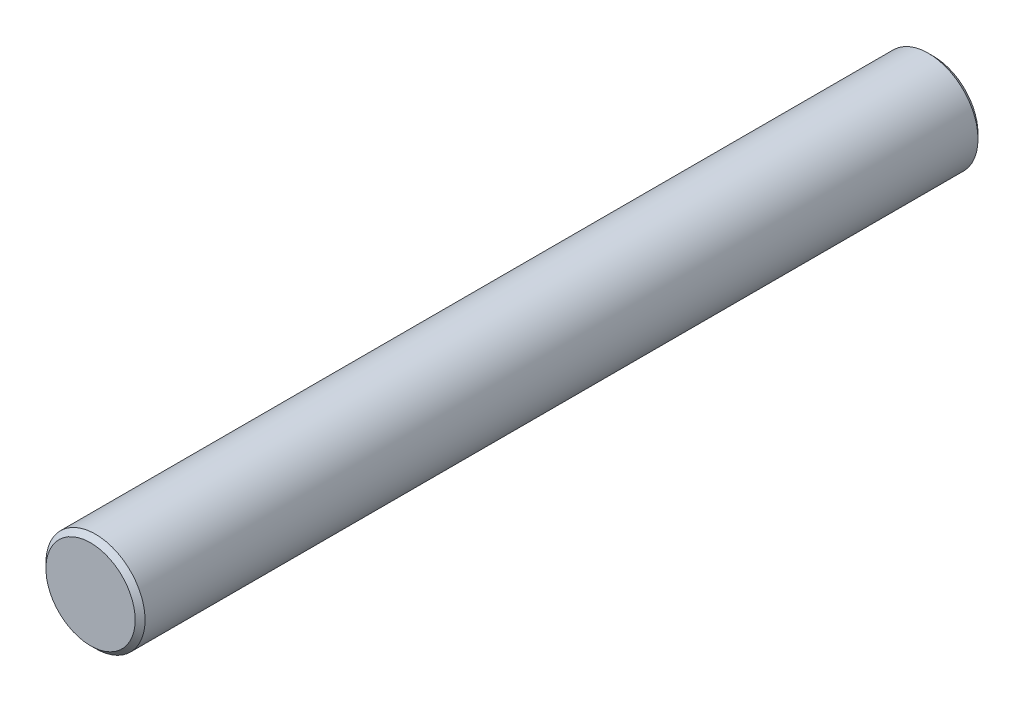
ISO-10303-21;
HEADER;
FILE_DESCRIPTION(('STEP AP214'),'2;1');
FILE_NAME('part.step','',(''),(''),'','','');
FILE_SCHEMA(('AUTOMOTIVE_DESIGN { 1 0 10303 214 1 1 1 1 }'));
ENDSEC;
DATA;
#1=APPLICATION_CONTEXT('core data for automotive mechanical design processes');
#2=APPLICATION_PROTOCOL_DEFINITION('international standard','automotive_design',2000,#1);
#3=PRODUCT_CONTEXT('',#1,'mechanical');
#4=PRODUCT('Part','Part','',(#3));
#5=PRODUCT_RELATED_PRODUCT_CATEGORY('part','',(#4));
#6=PRODUCT_DEFINITION_FORMATION('','',#4);
#7=PRODUCT_DEFINITION_CONTEXT('part definition',#1,'design');
#8=PRODUCT_DEFINITION('design','',#6,#7);
#9=PRODUCT_DEFINITION_SHAPE('','',#8);
#10=(LENGTH_UNIT() NAMED_UNIT(*) SI_UNIT(.MILLI.,.METRE.));
#11=(NAMED_UNIT(*) PLANE_ANGLE_UNIT() SI_UNIT($,.RADIAN.));
#12=(NAMED_UNIT(*) SI_UNIT($,.STERADIAN.) SOLID_ANGLE_UNIT());
#13=UNCERTAINTY_MEASURE_WITH_UNIT(LENGTH_MEASURE(1.E-05),#10,'distance_accuracy_value','');
#14=(GEOMETRIC_REPRESENTATION_CONTEXT(3) GLOBAL_UNCERTAINTY_ASSIGNED_CONTEXT((#13)) GLOBAL_UNIT_ASSIGNED_CONTEXT((#10,
#11,#12)) REPRESENTATION_CONTEXT('',''));
#15=CARTESIAN_POINT('',(0.,0.,0.));
#16=DIRECTION('',(0.,0.,1.));
#17=DIRECTION('',(1.,0.,0.));
#18=AXIS2_PLACEMENT_3D('',#15,#16,#17);
#19=CARTESIAN_POINT('',(0.,0.,170.));
#20=DIRECTION('',(0.,0.,-1.));
#21=DIRECTION('',(-1.,0.,0.));
#22=AXIS2_PLACEMENT_3D('',#19,#20,#21);
#23=CYLINDRICAL_SURFACE('',#22,10.);
#24=CARTESIAN_POINT('',(0.,0.,0.999999999999973));
#25=DIRECTION('',(0.,0.,1.));
#26=DIRECTION('',(1.,0.,0.));
#27=AXIS2_PLACEMENT_3D('',#24,#25,#26);
#28=CIRCLE('',#27,10.);
#29=CARTESIAN_POINT('',(10.,0.,0.999999999999973));
#30=VERTEX_POINT('',#29);
#31=EDGE_CURVE('E43',#30,#30,#28,.T.);
#32=ORIENTED_EDGE('',*,*,#31,.T.);
#33=EDGE_LOOP('',(#32));
#34=FACE_BOUND('',#33,.T.);
#35=CARTESIAN_POINT('',(0.,0.,169.));
#36=DIRECTION('',(0.,0.,1.));
#37=DIRECTION('',(1.,0.,0.));
#38=AXIS2_PLACEMENT_3D('',#35,#36,#37);
#39=CIRCLE('',#38,10.);
#40=CARTESIAN_POINT('',(10.,0.,169.));
#41=VERTEX_POINT('',#40);
#42=EDGE_CURVE('E47',#41,#41,#39,.F.);
#43=ORIENTED_EDGE('',*,*,#42,.T.);
#44=EDGE_LOOP('',(#43));
#45=FACE_BOUND('',#44,.T.);
#46=ADVANCED_FACE('F32',(#34,#45),#23,.T.);
#47=CARTESIAN_POINT('',(0.,0.,170.));
#48=DIRECTION('',(0.,0.,1.));
#49=DIRECTION('',(1.,0.,0.));
#50=AXIS2_PLACEMENT_3D('',#47,#48,#49);
#51=PLANE('',#50);
#52=CARTESIAN_POINT('',(0.,0.,170.));
#53=DIRECTION('',(0.,0.,1.));
#54=DIRECTION('',(1.,0.,0.));
#55=AXIS2_PLACEMENT_3D('',#52,#53,#54);
#56=CIRCLE('',#55,9.00000000000001);
#57=CARTESIAN_POINT('',(9.00000000000001,0.,170.));
#58=VERTEX_POINT('',#57);
#59=EDGE_CURVE('E10',#58,#58,#56,.T.);
#60=ORIENTED_EDGE('',*,*,#59,.T.);
#61=EDGE_LOOP('',(#60));
#62=FACE_BOUND('',#61,.T.);
#63=ADVANCED_FACE('F63',(#62),#51,.T.);
#64=CARTESIAN_POINT('',(0.,0.,0.));
#65=DIRECTION('',(0.,0.,1.));
#66=DIRECTION('',(1.,0.,0.));
#67=AXIS2_PLACEMENT_3D('',#64,#65,#66);
#68=PLANE('',#67);
#69=CARTESIAN_POINT('',(0.,0.,0.));
#70=DIRECTION('',(0.,0.,1.));
#71=DIRECTION('',(1.,0.,0.));
#72=AXIS2_PLACEMENT_3D('',#69,#70,#71);
#73=CIRCLE('',#72,9.00000000000002);
#74=CARTESIAN_POINT('',(9.00000000000002,0.,0.));
#75=VERTEX_POINT('',#74);
#76=EDGE_CURVE('E39',#75,#75,#73,.F.);
#77=ORIENTED_EDGE('',*,*,#76,.T.);
#78=EDGE_LOOP('',(#77));
#79=FACE_BOUND('',#78,.T.);
#80=ADVANCED_FACE('F60',(#79),#68,.F.);
#81=CARTESIAN_POINT('',(0.,0.,0.999999999999973));
#82=DIRECTION('',(0.,0.,1.));
#83=DIRECTION('',(1.,0.,0.));
#84=AXIS2_PLACEMENT_3D('',#81,#82,#83);
#85=CONICAL_SURFACE('',#84,10.,0.785398163397451);
#86=ORIENTED_EDGE('',*,*,#76,.F.);
#87=EDGE_LOOP('',(#86));
#88=FACE_BOUND('',#87,.T.);
#89=ORIENTED_EDGE('',*,*,#31,.F.);
#90=EDGE_LOOP('',(#89));
#91=FACE_BOUND('',#90,.T.);
#92=ADVANCED_FACE('F56',(#88,#91),#85,.T.);
#93=CARTESIAN_POINT('',(0.,0.,170.));
#94=DIRECTION('',(0.,0.,-1.));
#95=DIRECTION('',(-1.,0.,0.));
#96=AXIS2_PLACEMENT_3D('',#93,#94,#95);
#97=CONICAL_SURFACE('',#96,9.00000000000001,0.785398163397444);
#98=ORIENTED_EDGE('',*,*,#42,.F.);
#99=EDGE_LOOP('',(#98));
#100=FACE_BOUND('',#99,.T.);
#101=ORIENTED_EDGE('',*,*,#59,.F.);
#102=EDGE_LOOP('',(#101));
#103=FACE_BOUND('',#102,.T.);
#104=ADVANCED_FACE('F34',(#100,#103),#97,.T.);
#105=CLOSED_SHELL('',(#46,#63,#80,#92,#104));
#106=MANIFOLD_SOLID_BREP('B2',#105);
#107=ADVANCED_BREP_SHAPE_REPRESENTATION('',(#18,#106),#14);
#108=SHAPE_DEFINITION_REPRESENTATION(#9,#107);
ENDSEC;
END-ISO-10303-21;
